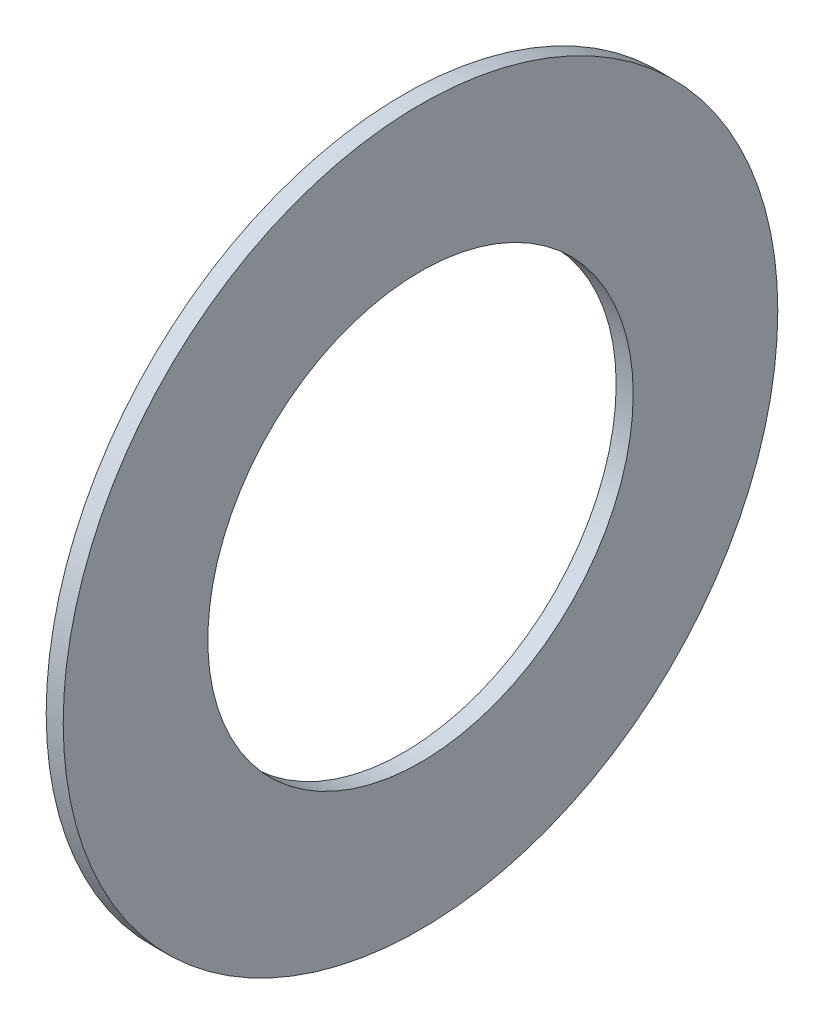
ISO-10303-21;
HEADER;
FILE_DESCRIPTION(('STEP AP214'),'2;1');
FILE_NAME('part.step','',(''),(''),'','','');
FILE_SCHEMA(('AUTOMOTIVE_DESIGN { 1 0 10303 214 1 1 1 1 }'));
ENDSEC;
DATA;
#1=APPLICATION_CONTEXT('core data for automotive mechanical design processes');
#2=APPLICATION_PROTOCOL_DEFINITION('international standard','automotive_design',2000,#1);
#3=PRODUCT_CONTEXT('',#1,'mechanical');
#4=PRODUCT('Part','Part','',(#3));
#5=PRODUCT_RELATED_PRODUCT_CATEGORY('part','',(#4));
#6=PRODUCT_DEFINITION_FORMATION('','',#4);
#7=PRODUCT_DEFINITION_CONTEXT('part definition',#1,'design');
#8=PRODUCT_DEFINITION('design','',#6,#7);
#9=PRODUCT_DEFINITION_SHAPE('','',#8);
#10=(LENGTH_UNIT() NAMED_UNIT(*) SI_UNIT(.MILLI.,.METRE.));
#11=(NAMED_UNIT(*) PLANE_ANGLE_UNIT() SI_UNIT($,.RADIAN.));
#12=(NAMED_UNIT(*) SI_UNIT($,.STERADIAN.) SOLID_ANGLE_UNIT());
#13=UNCERTAINTY_MEASURE_WITH_UNIT(LENGTH_MEASURE(1.E-05),#10,'distance_accuracy_value','');
#14=(GEOMETRIC_REPRESENTATION_CONTEXT(3) GLOBAL_UNCERTAINTY_ASSIGNED_CONTEXT((#13)) GLOBAL_UNIT_ASSIGNED_CONTEXT((#10,
#11,#12)) REPRESENTATION_CONTEXT('',''));
#15=CARTESIAN_POINT('',(0.,0.,0.));
#16=DIRECTION('',(0.,0.,1.));
#17=DIRECTION('',(1.,0.,0.));
#18=AXIS2_PLACEMENT_3D('',#15,#16,#17);
#19=CARTESIAN_POINT('',(1.,0.,0.));
#20=DIRECTION('',(1.,0.,0.));
#21=DIRECTION('',(0.,0.,-1.));
#22=AXIS2_PLACEMENT_3D('',#19,#20,#21);
#23=PLANE('',#22);
#24=CARTESIAN_POINT('',(1.,0.,0.));
#25=DIRECTION('',(1.,0.,0.));
#26=DIRECTION('',(0.,0.,-1.));
#27=AXIS2_PLACEMENT_3D('',#24,#25,#26);
#28=CIRCLE('',#27,21.);
#29=CARTESIAN_POINT('',(1.,0.,-21.));
#30=VERTEX_POINT('',#29);
#31=EDGE_CURVE('E10',#30,#30,#28,.T.);
#32=ORIENTED_EDGE('',*,*,#31,.T.);
#33=EDGE_LOOP('',(#32));
#34=FACE_BOUND('',#33,.T.);
#35=CARTESIAN_POINT('',(1.,0.,0.));
#36=DIRECTION('',(1.,0.,0.));
#37=DIRECTION('',(0.,0.,-1.));
#38=AXIS2_PLACEMENT_3D('',#35,#36,#37);
#39=CIRCLE('',#38,12.5);
#40=CARTESIAN_POINT('',(1.,0.,-12.5));
#41=VERTEX_POINT('',#40);
#42=EDGE_CURVE('E44',#41,#41,#39,.T.);
#43=ORIENTED_EDGE('',*,*,#42,.F.);
#44=EDGE_LOOP('',(#43));
#45=FACE_BOUND('',#44,.T.);
#46=ADVANCED_FACE('F33',(#34,#45),#23,.T.);
#47=CARTESIAN_POINT('',(0.,0.,0.));
#48=DIRECTION('',(1.,0.,0.));
#49=DIRECTION('',(0.,0.,-1.));
#50=AXIS2_PLACEMENT_3D('',#47,#48,#49);
#51=PLANE('',#50);
#52=CARTESIAN_POINT('',(0.,0.,0.));
#53=DIRECTION('',(1.,0.,0.));
#54=DIRECTION('',(0.,0.,-1.));
#55=AXIS2_PLACEMENT_3D('',#52,#53,#54);
#56=CIRCLE('',#55,21.);
#57=CARTESIAN_POINT('',(0.,0.,-21.));
#58=VERTEX_POINT('',#57);
#59=EDGE_CURVE('E37',#58,#58,#56,.T.);
#60=ORIENTED_EDGE('',*,*,#59,.F.);
#61=EDGE_LOOP('',(#60));
#62=FACE_BOUND('',#61,.T.);
#63=CARTESIAN_POINT('',(0.,0.,0.));
#64=DIRECTION('',(1.,0.,0.));
#65=DIRECTION('',(0.,0.,-1.));
#66=AXIS2_PLACEMENT_3D('',#63,#64,#65);
#67=CIRCLE('',#66,12.5);
#68=CARTESIAN_POINT('',(0.,0.,-12.5));
#69=VERTEX_POINT('',#68);
#70=EDGE_CURVE('E46',#69,#69,#67,.T.);
#71=ORIENTED_EDGE('',*,*,#70,.T.);
#72=EDGE_LOOP('',(#71));
#73=FACE_BOUND('',#72,.T.);
#74=ADVANCED_FACE('F56',(#62,#73),#51,.F.);
#75=CARTESIAN_POINT('',(1.,0.,0.));
#76=DIRECTION('',(-1.,0.,0.));
#77=DIRECTION('',(0.,0.,1.));
#78=AXIS2_PLACEMENT_3D('',#75,#76,#77);
#79=CYLINDRICAL_SURFACE('',#78,21.);
#80=ORIENTED_EDGE('',*,*,#31,.F.);
#81=EDGE_LOOP('',(#80));
#82=FACE_BOUND('',#81,.T.);
#83=ORIENTED_EDGE('',*,*,#59,.T.);
#84=EDGE_LOOP('',(#83));
#85=FACE_BOUND('',#84,.T.);
#86=ADVANCED_FACE('F35',(#82,#85),#79,.T.);
#87=CARTESIAN_POINT('',(1.,0.,0.));
#88=DIRECTION('',(-1.,0.,0.));
#89=DIRECTION('',(0.,0.,1.));
#90=AXIS2_PLACEMENT_3D('',#87,#88,#89);
#91=CYLINDRICAL_SURFACE('',#90,12.5);
#92=ORIENTED_EDGE('',*,*,#42,.T.);
#93=EDGE_LOOP('',(#92));
#94=FACE_BOUND('',#93,.T.);
#95=ORIENTED_EDGE('',*,*,#70,.F.);
#96=EDGE_LOOP('',(#95));
#97=FACE_BOUND('',#96,.T.);
#98=ADVANCED_FACE('F52',(#94,#97),#91,.F.);
#99=CLOSED_SHELL('',(#46,#74,#86,#98));
#100=MANIFOLD_SOLID_BREP('B2',#99);
#101=ADVANCED_BREP_SHAPE_REPRESENTATION('',(#18,#100),#14);
#102=SHAPE_DEFINITION_REPRESENTATION(#9,#101);
ENDSEC;
END-ISO-10303-21;
